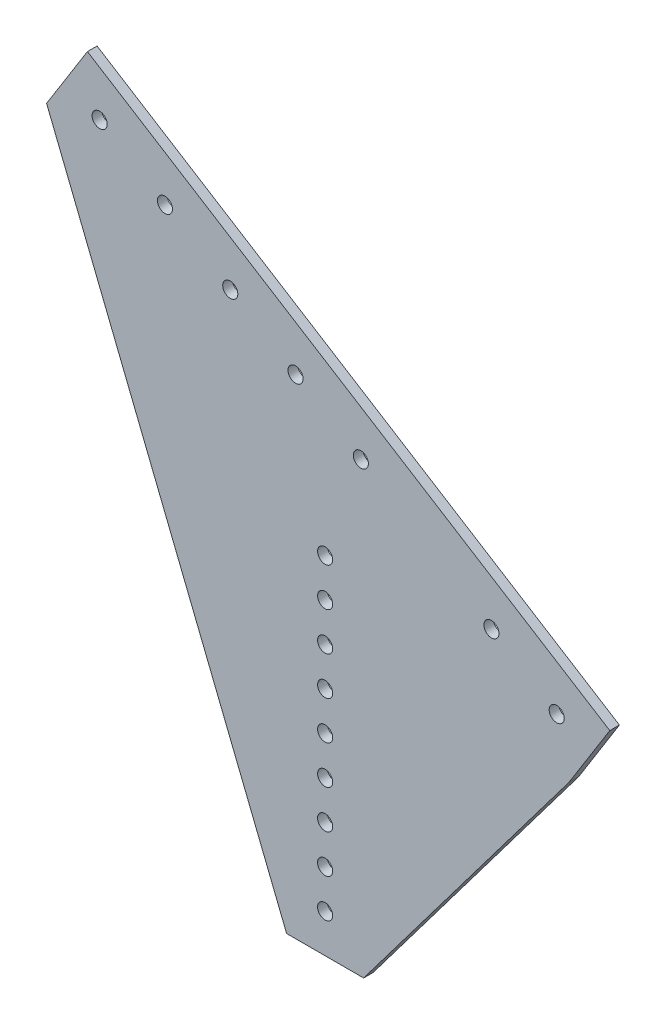
ISO-10303-21;
HEADER;
FILE_DESCRIPTION(('STEP AP214'),'2;1');
FILE_NAME('part.step','',(''),(''),'','','');
FILE_SCHEMA(('AUTOMOTIVE_DESIGN { 1 0 10303 214 1 1 1 1 }'));
ENDSEC;
DATA;
#1=APPLICATION_CONTEXT('core data for automotive mechanical design processes');
#2=APPLICATION_PROTOCOL_DEFINITION('international standard','automotive_design',2000,#1);
#3=PRODUCT_CONTEXT('',#1,'mechanical');
#4=PRODUCT('Part','Part','',(#3));
#5=PRODUCT_RELATED_PRODUCT_CATEGORY('part','',(#4));
#6=PRODUCT_DEFINITION_FORMATION('','',#4);
#7=PRODUCT_DEFINITION_CONTEXT('part definition',#1,'design');
#8=PRODUCT_DEFINITION('design','',#6,#7);
#9=PRODUCT_DEFINITION_SHAPE('','',#8);
#10=(LENGTH_UNIT() NAMED_UNIT(*) SI_UNIT(.MILLI.,.METRE.));
#11=(NAMED_UNIT(*) PLANE_ANGLE_UNIT() SI_UNIT($,.RADIAN.));
#12=(NAMED_UNIT(*) SI_UNIT($,.STERADIAN.) SOLID_ANGLE_UNIT());
#13=UNCERTAINTY_MEASURE_WITH_UNIT(LENGTH_MEASURE(1.E-05),#10,'distance_accuracy_value','');
#14=(GEOMETRIC_REPRESENTATION_CONTEXT(3) GLOBAL_UNCERTAINTY_ASSIGNED_CONTEXT((#13)) GLOBAL_UNIT_ASSIGNED_CONTEXT((#10,
#11,#12)) REPRESENTATION_CONTEXT('',''));
#15=CARTESIAN_POINT('',(0.,0.,0.));
#16=DIRECTION('',(0.,0.,1.));
#17=DIRECTION('',(1.,0.,0.));
#18=AXIS2_PLACEMENT_3D('',#15,#16,#17);
#19=CARTESIAN_POINT('',(0.,0.,3.175));
#20=DIRECTION('',(0.,0.,-1.));
#21=DIRECTION('',(-1.,0.,0.));
#22=AXIS2_PLACEMENT_3D('',#19,#20,#21);
#23=PLANE('',#22);
#24=CARTESIAN_POINT('',(151.49329516949,783.277222158567,3.175));
#25=DIRECTION('',(0.,0.,1.));
#26=DIRECTION('',(1.,0.,0.));
#27=AXIS2_PLACEMENT_3D('',#24,#25,#26);
#28=CIRCLE('',#27,2.48919999999999);
#29=CARTESIAN_POINT('',(153.98249516949,783.277222158567,3.175));
#30=VERTEX_POINT('',#29);
#31=EDGE_CURVE('E254',#30,#30,#28,.T.);
#32=ORIENTED_EDGE('',*,*,#31,.F.);
#33=EDGE_LOOP('',(#32));
#34=FACE_BOUND('',#33,.T.);
#35=CARTESIAN_POINT('',(173.024754388706,769.802940586208,3.175));
#36=DIRECTION('',(0.,0.,1.));
#37=DIRECTION('',(1.,0.,0.));
#38=AXIS2_PLACEMENT_3D('',#35,#36,#37);
#39=CIRCLE('',#38,2.48919999999999);
#40=CARTESIAN_POINT('',(175.513954388706,769.802940586208,3.175));
#41=VERTEX_POINT('',#40);
#42=EDGE_CURVE('E261',#41,#41,#39,.T.);
#43=ORIENTED_EDGE('',*,*,#42,.F.);
#44=EDGE_LOOP('',(#43));
#45=FACE_BOUND('',#44,.T.);
#46=CARTESIAN_POINT('',(194.556213607923,756.328659013849,3.175));
#47=DIRECTION('',(0.,0.,1.));
#48=DIRECTION('',(1.,0.,0.));
#49=AXIS2_PLACEMENT_3D('',#46,#47,#48);
#50=CIRCLE('',#49,2.48919999999999);
#51=CARTESIAN_POINT('',(197.045413607923,756.328659013849,3.175));
#52=VERTEX_POINT('',#51);
#53=EDGE_CURVE('E267',#52,#52,#50,.T.);
#54=ORIENTED_EDGE('',*,*,#53,.F.);
#55=EDGE_LOOP('',(#54));
#56=FACE_BOUND('',#55,.T.);
#57=CARTESIAN_POINT('',(259.150591265572,715.905814296771,3.175));
#58=DIRECTION('',(0.,0.,1.));
#59=DIRECTION('',(1.,0.,0.));
#60=AXIS2_PLACEMENT_3D('',#57,#58,#59);
#61=CIRCLE('',#60,2.48919999999994);
#62=CARTESIAN_POINT('',(261.639791265572,715.905814296771,3.175));
#63=VERTEX_POINT('',#62);
#64=EDGE_CURVE('E273',#63,#63,#61,.T.);
#65=ORIENTED_EDGE('',*,*,#64,.F.);
#66=EDGE_LOOP('',(#65));
#67=FACE_BOUND('',#66,.T.);
#68=CARTESIAN_POINT('',(237.619132046355,729.38009586913,3.175));
#69=DIRECTION('',(0.,0.,1.));
#70=DIRECTION('',(1.,0.,0.));
#71=AXIS2_PLACEMENT_3D('',#68,#69,#70);
#72=CIRCLE('',#71,2.48919999999999);
#73=CARTESIAN_POINT('',(240.108332046355,729.38009586913,3.175));
#74=VERTEX_POINT('',#73);
#75=EDGE_CURVE('E239',#74,#74,#72,.T.);
#76=ORIENTED_EDGE('',*,*,#75,.F.);
#77=EDGE_LOOP('',(#76));
#78=FACE_BOUND('',#77,.T.);
#79=CARTESIAN_POINT('',(108.430376731057,810.225785303285,3.175));
#80=DIRECTION('',(0.,0.,1.));
#81=DIRECTION('',(1.,0.,0.));
#82=AXIS2_PLACEMENT_3D('',#79,#80,#81);
#83=CIRCLE('',#82,2.48919999999999);
#84=CARTESIAN_POINT('',(110.919576731057,810.225785303285,3.175));
#85=VERTEX_POINT('',#84);
#86=EDGE_CURVE('E244',#85,#85,#83,.T.);
#87=ORIENTED_EDGE('',*,*,#86,.F.);
#88=EDGE_LOOP('',(#87));
#89=FACE_BOUND('',#88,.T.);
#90=CARTESIAN_POINT('',(129.961835950274,796.751503730926,3.175));
#91=DIRECTION('',(0.,0.,1.));
#92=DIRECTION('',(1.,0.,0.));
#93=AXIS2_PLACEMENT_3D('',#90,#91,#92);
#94=CIRCLE('',#93,2.48919999999999);
#95=CARTESIAN_POINT('',(132.451035950274,796.751503730926,3.175));
#96=VERTEX_POINT('',#95);
#97=EDGE_CURVE('E278',#96,#96,#94,.T.);
#98=ORIENTED_EDGE('',*,*,#97,.F.);
#99=EDGE_LOOP('',(#98));
#100=FACE_BOUND('',#99,.T.);
#101=DIRECTION('',(-0.530483526470835,-0.847695244851041,0.));
#102=VECTOR('',#101,1.);
#103=CARTESIAN_POINT('',(90.9275063352694,806.197196479857,3.175));
#104=LINE('',#103,#102);
#105=CARTESIAN_POINT('',(104.401787907629,827.728655699073,3.175));
#106=VERTEX_POINT('',#105);
#107=CARTESIAN_POINT('',(90.9275063352694,806.197196479857,3.175));
#108=VERTEX_POINT('',#107);
#109=EDGE_CURVE('E139',#106,#108,#104,.T.);
#110=ORIENTED_EDGE('',*,*,#109,.T.);
#111=DIRECTION('',(0.371984831101606,-0.928238808405633,0.));
#112=VECTOR('',#111,1.);
#113=CARTESIAN_POINT('',(170.07673083068,608.69080458136,3.175));
#114=LINE('',#113,#112);
#115=CARTESIAN_POINT('',(170.07673083068,608.69080458136,3.175));
#116=VERTEX_POINT('',#115);
#117=EDGE_CURVE('E97',#108,#116,#114,.T.);
#118=ORIENTED_EDGE('',*,*,#117,.T.);
#119=DIRECTION('',(1.,0.,0.));
#120=VECTOR('',#119,1.);
#121=CARTESIAN_POINT('',(195.476730830681,608.690804581359,3.175));
#122=LINE('',#121,#120);
#123=CARTESIAN_POINT('',(195.476730830681,608.690804581359,3.175));
#124=VERTEX_POINT('',#123);
#125=EDGE_CURVE('E110',#116,#124,#122,.T.);
#126=ORIENTED_EDGE('',*,*,#125,.T.);
#127=DIRECTION('',(0.602379550490684,0.798209795198381,0.));
#128=VECTOR('',#127,1.);
#129=CARTESIAN_POINT('',(263.179180089001,698.402943900983,3.175));
#130=LINE('',#129,#128);
#131=CARTESIAN_POINT('',(263.179180089001,698.402943900983,3.175));
#132=VERTEX_POINT('',#131);
#133=EDGE_CURVE('E104',#124,#132,#130,.T.);
#134=ORIENTED_EDGE('',*,*,#133,.T.);
#135=DIRECTION('',(0.530483526470834,0.847695244851042,0.));
#136=VECTOR('',#135,1.);
#137=CARTESIAN_POINT('',(276.65346166136,719.934403120199,3.175));
#138=LINE('',#137,#136);
#139=CARTESIAN_POINT('',(276.65346166136,719.934403120199,3.175));
#140=VERTEX_POINT('',#139);
#141=EDGE_CURVE('E108',#132,#140,#138,.T.);
#142=ORIENTED_EDGE('',*,*,#141,.T.);
#143=DIRECTION('',(-0.847695244851041,0.530483526470836,0.));
#144=VECTOR('',#143,1.);
#145=CARTESIAN_POINT('',(104.401787907629,827.728655699073,3.175));
#146=LINE('',#145,#144);
#147=EDGE_CURVE('E60',#140,#106,#146,.T.);
#148=ORIENTED_EDGE('',*,*,#147,.T.);
#149=EDGE_LOOP('',(#110,#118,#126,#134,#142,#148));
#150=FACE_BOUND('',#149,.T.);
#151=CARTESIAN_POINT('',(182.77673083068,621.390804581359,3.175));
#152=DIRECTION('',(0.,0.,1.));
#153=DIRECTION('',(1.,0.,0.));
#154=AXIS2_PLACEMENT_3D('',#151,#152,#153);
#155=CIRCLE('',#154,2.48919999999999);
#156=CARTESIAN_POINT('',(185.26593083068,621.390804581359,3.175));
#157=VERTEX_POINT('',#156);
#158=EDGE_CURVE('E132',#157,#157,#155,.T.);
#159=ORIENTED_EDGE('',*,*,#158,.F.);
#160=EDGE_LOOP('',(#159));
#161=FACE_BOUND('',#160,.T.);
#162=CARTESIAN_POINT('',(182.77673083068,634.09080458136,3.175));
#163=DIRECTION('',(0.,0.,1.));
#164=DIRECTION('',(1.,0.,0.));
#165=AXIS2_PLACEMENT_3D('',#162,#163,#164);
#166=CIRCLE('',#165,2.48919999999999);
#167=CARTESIAN_POINT('',(185.26593083068,634.09080458136,3.175));
#168=VERTEX_POINT('',#167);
#169=EDGE_CURVE('E326',#168,#168,#166,.T.);
#170=ORIENTED_EDGE('',*,*,#169,.F.);
#171=EDGE_LOOP('',(#170));
#172=FACE_BOUND('',#171,.T.);
#173=CARTESIAN_POINT('',(182.77673083068,646.79080458136,3.175));
#174=DIRECTION('',(0.,0.,1.));
#175=DIRECTION('',(1.,0.,0.));
#176=AXIS2_PLACEMENT_3D('',#173,#174,#175);
#177=CIRCLE('',#176,2.48919999999999);
#178=CARTESIAN_POINT('',(185.26593083068,646.79080458136,3.175));
#179=VERTEX_POINT('',#178);
#180=EDGE_CURVE('E320',#179,#179,#177,.T.);
#181=ORIENTED_EDGE('',*,*,#180,.F.);
#182=EDGE_LOOP('',(#181));
#183=FACE_BOUND('',#182,.T.);
#184=CARTESIAN_POINT('',(182.77673083068,659.49080458136,3.175));
#185=DIRECTION('',(0.,0.,1.));
#186=DIRECTION('',(1.,0.,0.));
#187=AXIS2_PLACEMENT_3D('',#184,#185,#186);
#188=CIRCLE('',#187,2.48919999999999);
#189=CARTESIAN_POINT('',(185.26593083068,659.49080458136,3.175));
#190=VERTEX_POINT('',#189);
#191=EDGE_CURVE('E314',#190,#190,#188,.T.);
#192=ORIENTED_EDGE('',*,*,#191,.F.);
#193=EDGE_LOOP('',(#192));
#194=FACE_BOUND('',#193,.T.);
#195=CARTESIAN_POINT('',(182.77673083068,672.19080458136,3.175));
#196=DIRECTION('',(0.,0.,1.));
#197=DIRECTION('',(1.,0.,0.));
#198=AXIS2_PLACEMENT_3D('',#195,#196,#197);
#199=CIRCLE('',#198,2.48919999999999);
#200=CARTESIAN_POINT('',(185.26593083068,672.19080458136,3.175));
#201=VERTEX_POINT('',#200);
#202=EDGE_CURVE('E308',#201,#201,#199,.T.);
#203=ORIENTED_EDGE('',*,*,#202,.F.);
#204=EDGE_LOOP('',(#203));
#205=FACE_BOUND('',#204,.T.);
#206=CARTESIAN_POINT('',(182.77673083068,684.89080458136,3.175));
#207=DIRECTION('',(0.,0.,1.));
#208=DIRECTION('',(1.,0.,0.));
#209=AXIS2_PLACEMENT_3D('',#206,#207,#208);
#210=CIRCLE('',#209,2.48919999999999);
#211=CARTESIAN_POINT('',(185.26593083068,684.89080458136,3.175));
#212=VERTEX_POINT('',#211);
#213=EDGE_CURVE('E302',#212,#212,#210,.T.);
#214=ORIENTED_EDGE('',*,*,#213,.F.);
#215=EDGE_LOOP('',(#214));
#216=FACE_BOUND('',#215,.T.);
#217=CARTESIAN_POINT('',(182.77673083068,697.59080458136,3.175));
#218=DIRECTION('',(0.,0.,1.));
#219=DIRECTION('',(1.,0.,0.));
#220=AXIS2_PLACEMENT_3D('',#217,#218,#219);
#221=CIRCLE('',#220,2.48919999999999);
#222=CARTESIAN_POINT('',(185.26593083068,697.59080458136,3.175));
#223=VERTEX_POINT('',#222);
#224=EDGE_CURVE('E296',#223,#223,#221,.T.);
#225=ORIENTED_EDGE('',*,*,#224,.F.);
#226=EDGE_LOOP('',(#225));
#227=FACE_BOUND('',#226,.T.);
#228=CARTESIAN_POINT('',(182.77673083068,710.29080458136,3.175));
#229=DIRECTION('',(0.,0.,1.));
#230=DIRECTION('',(1.,0.,0.));
#231=AXIS2_PLACEMENT_3D('',#228,#229,#230);
#232=CIRCLE('',#231,2.48919999999999);
#233=CARTESIAN_POINT('',(185.26593083068,710.29080458136,3.175));
#234=VERTEX_POINT('',#233);
#235=EDGE_CURVE('E290',#234,#234,#232,.T.);
#236=ORIENTED_EDGE('',*,*,#235,.F.);
#237=EDGE_LOOP('',(#236));
#238=FACE_BOUND('',#237,.T.);
#239=CARTESIAN_POINT('',(182.77673083068,722.99080458136,3.175));
#240=DIRECTION('',(0.,0.,1.));
#241=DIRECTION('',(1.,0.,0.));
#242=AXIS2_PLACEMENT_3D('',#239,#240,#241);
#243=CIRCLE('',#242,2.48919999999999);
#244=CARTESIAN_POINT('',(185.26593083068,722.99080458136,3.175));
#245=VERTEX_POINT('',#244);
#246=EDGE_CURVE('E284',#245,#245,#243,.T.);
#247=ORIENTED_EDGE('',*,*,#246,.F.);
#248=EDGE_LOOP('',(#247));
#249=FACE_BOUND('',#248,.T.);
#250=ADVANCED_FACE('F43',(#34,#45,#56,#67,#78,#89,#100,#150,#161,#172,#183,#194,#205,#216,#227,
#238,#249),#23,.F.);
#251=CARTESIAN_POINT('',(0.,0.,0.));
#252=DIRECTION('',(0.,0.,-1.));
#253=DIRECTION('',(-1.,0.,0.));
#254=AXIS2_PLACEMENT_3D('',#251,#252,#253);
#255=PLANE('',#254);
#256=CARTESIAN_POINT('',(151.49329516949,783.277222158567,0.));
#257=DIRECTION('',(0.,0.,1.));
#258=DIRECTION('',(1.,0.,0.));
#259=AXIS2_PLACEMENT_3D('',#256,#257,#258);
#260=CIRCLE('',#259,2.48919999999999);
#261=CARTESIAN_POINT('',(153.98249516949,783.277222158567,0.));
#262=VERTEX_POINT('',#261);
#263=EDGE_CURVE('E258',#262,#262,#260,.T.);
#264=ORIENTED_EDGE('',*,*,#263,.T.);
#265=EDGE_LOOP('',(#264));
#266=FACE_BOUND('',#265,.T.);
#267=CARTESIAN_POINT('',(173.024754388706,769.802940586208,0.));
#268=DIRECTION('',(0.,0.,1.));
#269=DIRECTION('',(1.,0.,0.));
#270=AXIS2_PLACEMENT_3D('',#267,#268,#269);
#271=CIRCLE('',#270,2.48919999999999);
#272=CARTESIAN_POINT('',(175.513954388706,769.802940586208,0.));
#273=VERTEX_POINT('',#272);
#274=EDGE_CURVE('E264',#273,#273,#271,.T.);
#275=ORIENTED_EDGE('',*,*,#274,.T.);
#276=EDGE_LOOP('',(#275));
#277=FACE_BOUND('',#276,.T.);
#278=CARTESIAN_POINT('',(194.556213607923,756.328659013849,0.));
#279=DIRECTION('',(0.,0.,1.));
#280=DIRECTION('',(1.,0.,0.));
#281=AXIS2_PLACEMENT_3D('',#278,#279,#280);
#282=CIRCLE('',#281,2.48919999999999);
#283=CARTESIAN_POINT('',(197.045413607923,756.328659013849,0.));
#284=VERTEX_POINT('',#283);
#285=EDGE_CURVE('E270',#284,#284,#282,.T.);
#286=ORIENTED_EDGE('',*,*,#285,.T.);
#287=EDGE_LOOP('',(#286));
#288=FACE_BOUND('',#287,.T.);
#289=CARTESIAN_POINT('',(259.150591265572,715.905814296771,0.));
#290=DIRECTION('',(0.,0.,1.));
#291=DIRECTION('',(1.,0.,0.));
#292=AXIS2_PLACEMENT_3D('',#289,#290,#291);
#293=CIRCLE('',#292,2.48919999999994);
#294=CARTESIAN_POINT('',(261.639791265572,715.905814296771,0.));
#295=VERTEX_POINT('',#294);
#296=EDGE_CURVE('E246',#295,#295,#293,.T.);
#297=ORIENTED_EDGE('',*,*,#296,.T.);
#298=EDGE_LOOP('',(#297));
#299=FACE_BOUND('',#298,.T.);
#300=CARTESIAN_POINT('',(237.619132046355,729.38009586913,0.));
#301=DIRECTION('',(0.,0.,1.));
#302=DIRECTION('',(1.,0.,0.));
#303=AXIS2_PLACEMENT_3D('',#300,#301,#302);
#304=CIRCLE('',#303,2.48919999999999);
#305=CARTESIAN_POINT('',(240.108332046355,729.38009586913,0.));
#306=VERTEX_POINT('',#305);
#307=EDGE_CURVE('E242',#306,#306,#304,.T.);
#308=ORIENTED_EDGE('',*,*,#307,.T.);
#309=EDGE_LOOP('',(#308));
#310=FACE_BOUND('',#309,.T.);
#311=CARTESIAN_POINT('',(108.430376731057,810.225785303285,0.));
#312=DIRECTION('',(0.,0.,1.));
#313=DIRECTION('',(1.,0.,0.));
#314=AXIS2_PLACEMENT_3D('',#311,#312,#313);
#315=CIRCLE('',#314,2.48919999999999);
#316=CARTESIAN_POINT('',(110.919576731057,810.225785303285,0.));
#317=VERTEX_POINT('',#316);
#318=EDGE_CURVE('E249',#317,#317,#315,.T.);
#319=ORIENTED_EDGE('',*,*,#318,.T.);
#320=EDGE_LOOP('',(#319));
#321=FACE_BOUND('',#320,.T.);
#322=CARTESIAN_POINT('',(129.961835950274,796.751503730926,0.));
#323=DIRECTION('',(0.,0.,1.));
#324=DIRECTION('',(1.,0.,0.));
#325=AXIS2_PLACEMENT_3D('',#322,#323,#324);
#326=CIRCLE('',#325,2.48919999999999);
#327=CARTESIAN_POINT('',(132.451035950274,796.751503730926,0.));
#328=VERTEX_POINT('',#327);
#329=EDGE_CURVE('E257',#328,#328,#326,.T.);
#330=ORIENTED_EDGE('',*,*,#329,.T.);
#331=EDGE_LOOP('',(#330));
#332=FACE_BOUND('',#331,.T.);
#333=CARTESIAN_POINT('',(182.77673083068,710.29080458136,0.));
#334=DIRECTION('',(0.,0.,1.));
#335=DIRECTION('',(1.,0.,0.));
#336=AXIS2_PLACEMENT_3D('',#333,#334,#335);
#337=CIRCLE('',#336,2.48919999999999);
#338=CARTESIAN_POINT('',(185.26593083068,710.29080458136,0.));
#339=VERTEX_POINT('',#338);
#340=EDGE_CURVE('E287',#339,#339,#337,.T.);
#341=ORIENTED_EDGE('',*,*,#340,.T.);
#342=EDGE_LOOP('',(#341));
#343=FACE_BOUND('',#342,.T.);
#344=CARTESIAN_POINT('',(182.77673083068,684.89080458136,0.));
#345=DIRECTION('',(0.,0.,1.));
#346=DIRECTION('',(1.,0.,0.));
#347=AXIS2_PLACEMENT_3D('',#344,#345,#346);
#348=CIRCLE('',#347,2.48919999999999);
#349=CARTESIAN_POINT('',(185.26593083068,684.89080458136,0.));
#350=VERTEX_POINT('',#349);
#351=EDGE_CURVE('E299',#350,#350,#348,.T.);
#352=ORIENTED_EDGE('',*,*,#351,.T.);
#353=EDGE_LOOP('',(#352));
#354=FACE_BOUND('',#353,.T.);
#355=CARTESIAN_POINT('',(182.77673083068,659.49080458136,0.));
#356=DIRECTION('',(0.,0.,1.));
#357=DIRECTION('',(1.,0.,0.));
#358=AXIS2_PLACEMENT_3D('',#355,#356,#357);
#359=CIRCLE('',#358,2.48919999999999);
#360=CARTESIAN_POINT('',(185.26593083068,659.49080458136,0.));
#361=VERTEX_POINT('',#360);
#362=EDGE_CURVE('E311',#361,#361,#359,.T.);
#363=ORIENTED_EDGE('',*,*,#362,.T.);
#364=EDGE_LOOP('',(#363));
#365=FACE_BOUND('',#364,.T.);
#366=CARTESIAN_POINT('',(182.77673083068,634.09080458136,0.));
#367=DIRECTION('',(0.,0.,1.));
#368=DIRECTION('',(1.,0.,0.));
#369=AXIS2_PLACEMENT_3D('',#366,#367,#368);
#370=CIRCLE('',#369,2.48919999999999);
#371=CARTESIAN_POINT('',(185.26593083068,634.09080458136,0.));
#372=VERTEX_POINT('',#371);
#373=EDGE_CURVE('E323',#372,#372,#370,.T.);
#374=ORIENTED_EDGE('',*,*,#373,.T.);
#375=EDGE_LOOP('',(#374));
#376=FACE_BOUND('',#375,.T.);
#377=DIRECTION('',(-0.530483526470835,-0.847695244851041,0.));
#378=VECTOR('',#377,1.);
#379=CARTESIAN_POINT('',(90.9275063352694,806.197196479857,0.));
#380=LINE('',#379,#378);
#381=CARTESIAN_POINT('',(104.401787907629,827.728655699073,0.));
#382=VERTEX_POINT('',#381);
#383=CARTESIAN_POINT('',(90.9275063352694,806.197196479857,0.));
#384=VERTEX_POINT('',#383);
#385=EDGE_CURVE('E128',#382,#384,#380,.T.);
#386=ORIENTED_EDGE('',*,*,#385,.F.);
#387=DIRECTION('',(-0.847695244851041,0.530483526470836,0.));
#388=VECTOR('',#387,1.);
#389=CARTESIAN_POINT('',(104.401787907629,827.728655699073,0.));
#390=LINE('',#389,#388);
#391=CARTESIAN_POINT('',(276.65346166136,719.934403120199,0.));
#392=VERTEX_POINT('',#391);
#393=EDGE_CURVE('E89',#392,#382,#390,.T.);
#394=ORIENTED_EDGE('',*,*,#393,.F.);
#395=DIRECTION('',(0.530483526470834,0.847695244851042,0.));
#396=VECTOR('',#395,1.);
#397=CARTESIAN_POINT('',(276.65346166136,719.934403120199,0.));
#398=LINE('',#397,#396);
#399=CARTESIAN_POINT('',(263.179180089001,698.402943900983,0.));
#400=VERTEX_POINT('',#399);
#401=EDGE_CURVE('E83',#400,#392,#398,.T.);
#402=ORIENTED_EDGE('',*,*,#401,.F.);
#403=DIRECTION('',(0.602379550490684,0.798209795198381,0.));
#404=VECTOR('',#403,1.);
#405=CARTESIAN_POINT('',(263.179180089001,698.402943900983,0.));
#406=LINE('',#405,#404);
#407=CARTESIAN_POINT('',(195.476730830681,608.690804581359,0.));
#408=VERTEX_POINT('',#407);
#409=EDGE_CURVE('E118',#408,#400,#406,.T.);
#410=ORIENTED_EDGE('',*,*,#409,.F.);
#411=DIRECTION('',(1.,0.,0.));
#412=VECTOR('',#411,1.);
#413=CARTESIAN_POINT('',(195.476730830681,608.690804581359,0.));
#414=LINE('',#413,#412);
#415=CARTESIAN_POINT('',(170.07673083068,608.69080458136,0.));
#416=VERTEX_POINT('',#415);
#417=EDGE_CURVE('E134',#416,#408,#414,.T.);
#418=ORIENTED_EDGE('',*,*,#417,.F.);
#419=DIRECTION('',(0.371984831101606,-0.928238808405633,0.));
#420=VECTOR('',#419,1.);
#421=CARTESIAN_POINT('',(170.07673083068,608.69080458136,0.));
#422=LINE('',#421,#420);
#423=EDGE_CURVE('E131',#384,#416,#422,.T.);
#424=ORIENTED_EDGE('',*,*,#423,.F.);
#425=EDGE_LOOP('',(#386,#394,#402,#410,#418,#424));
#426=FACE_BOUND('',#425,.T.);
#427=CARTESIAN_POINT('',(182.77673083068,621.390804581359,0.));
#428=DIRECTION('',(0.,0.,1.));
#429=DIRECTION('',(1.,0.,0.));
#430=AXIS2_PLACEMENT_3D('',#427,#428,#429);
#431=CIRCLE('',#430,2.48919999999999);
#432=CARTESIAN_POINT('',(185.26593083068,621.390804581359,0.));
#433=VERTEX_POINT('',#432);
#434=EDGE_CURVE('E329',#433,#433,#431,.T.);
#435=ORIENTED_EDGE('',*,*,#434,.T.);
#436=EDGE_LOOP('',(#435));
#437=FACE_BOUND('',#436,.T.);
#438=CARTESIAN_POINT('',(182.77673083068,646.79080458136,0.));
#439=DIRECTION('',(0.,0.,1.));
#440=DIRECTION('',(1.,0.,0.));
#441=AXIS2_PLACEMENT_3D('',#438,#439,#440);
#442=CIRCLE('',#441,2.48919999999999);
#443=CARTESIAN_POINT('',(185.26593083068,646.79080458136,0.));
#444=VERTEX_POINT('',#443);
#445=EDGE_CURVE('E317',#444,#444,#442,.T.);
#446=ORIENTED_EDGE('',*,*,#445,.T.);
#447=EDGE_LOOP('',(#446));
#448=FACE_BOUND('',#447,.T.);
#449=CARTESIAN_POINT('',(182.77673083068,672.19080458136,0.));
#450=DIRECTION('',(0.,0.,1.));
#451=DIRECTION('',(1.,0.,0.));
#452=AXIS2_PLACEMENT_3D('',#449,#450,#451);
#453=CIRCLE('',#452,2.48919999999999);
#454=CARTESIAN_POINT('',(185.26593083068,672.19080458136,0.));
#455=VERTEX_POINT('',#454);
#456=EDGE_CURVE('E305',#455,#455,#453,.T.);
#457=ORIENTED_EDGE('',*,*,#456,.T.);
#458=EDGE_LOOP('',(#457));
#459=FACE_BOUND('',#458,.T.);
#460=CARTESIAN_POINT('',(182.77673083068,697.59080458136,0.));
#461=DIRECTION('',(0.,0.,1.));
#462=DIRECTION('',(1.,0.,0.));
#463=AXIS2_PLACEMENT_3D('',#460,#461,#462);
#464=CIRCLE('',#463,2.48919999999999);
#465=CARTESIAN_POINT('',(185.26593083068,697.59080458136,0.));
#466=VERTEX_POINT('',#465);
#467=EDGE_CURVE('E293',#466,#466,#464,.T.);
#468=ORIENTED_EDGE('',*,*,#467,.T.);
#469=EDGE_LOOP('',(#468));
#470=FACE_BOUND('',#469,.T.);
#471=CARTESIAN_POINT('',(182.77673083068,722.99080458136,0.));
#472=DIRECTION('',(0.,0.,1.));
#473=DIRECTION('',(1.,0.,0.));
#474=AXIS2_PLACEMENT_3D('',#471,#472,#473);
#475=CIRCLE('',#474,2.48919999999999);
#476=CARTESIAN_POINT('',(185.26593083068,722.99080458136,0.));
#477=VERTEX_POINT('',#476);
#478=EDGE_CURVE('E281',#477,#477,#475,.T.);
#479=ORIENTED_EDGE('',*,*,#478,.T.);
#480=EDGE_LOOP('',(#479));
#481=FACE_BOUND('',#480,.T.);
#482=ADVANCED_FACE('F148',(#266,#277,#288,#299,#310,#321,#332,#343,#354,#365,#376,#426,#437,
#448,#459,#470,#481),#255,.T.);
#483=CARTESIAN_POINT('',(90.9275063352694,806.197196479857,3.175));
#484=DIRECTION('',(0.847695244851041,-0.530483526470836,0.));
#485=DIRECTION('',(0.530483526470836,0.847695244851041,0.));
#486=AXIS2_PLACEMENT_3D('',#483,#484,#485);
#487=PLANE('',#486);
#488=ORIENTED_EDGE('',*,*,#385,.T.);
#489=DIRECTION('',(0.,0.,-1.));
#490=VECTOR('',#489,1.);
#491=CARTESIAN_POINT('',(90.9275063352694,806.197196479857,3.175));
#492=LINE('',#491,#490);
#493=EDGE_CURVE('E11',#108,#384,#492,.T.);
#494=ORIENTED_EDGE('',*,*,#493,.F.);
#495=ORIENTED_EDGE('',*,*,#109,.F.);
#496=DIRECTION('',(0.,0.,-1.));
#497=VECTOR('',#496,1.);
#498=CARTESIAN_POINT('',(104.401787907629,827.728655699073,3.175));
#499=LINE('',#498,#497);
#500=EDGE_CURVE('E124',#106,#382,#499,.T.);
#501=ORIENTED_EDGE('',*,*,#500,.T.);
#502=EDGE_LOOP('',(#488,#494,#495,#501));
#503=FACE_BOUND('',#502,.T.);
#504=ADVANCED_FACE('F45',(#503),#487,.F.);
#505=CARTESIAN_POINT('',(170.07673083068,608.69080458136,3.175));
#506=DIRECTION('',(0.928238808405633,0.371984831101606,0.));
#507=DIRECTION('',(-0.371984831101606,0.928238808405633,0.));
#508=AXIS2_PLACEMENT_3D('',#505,#506,#507);
#509=PLANE('',#508);
#510=ORIENTED_EDGE('',*,*,#423,.T.);
#511=DIRECTION('',(0.,0.,-1.));
#512=VECTOR('',#511,1.);
#513=CARTESIAN_POINT('',(170.07673083068,608.69080458136,3.175));
#514=LINE('',#513,#512);
#515=EDGE_CURVE('E52',#116,#416,#514,.T.);
#516=ORIENTED_EDGE('',*,*,#515,.F.);
#517=ORIENTED_EDGE('',*,*,#117,.F.);
#518=ORIENTED_EDGE('',*,*,#493,.T.);
#519=EDGE_LOOP('',(#510,#516,#517,#518));
#520=FACE_BOUND('',#519,.T.);
#521=ADVANCED_FACE('F512',(#520),#509,.F.);
#522=CARTESIAN_POINT('',(195.476730830681,608.690804581359,3.175));
#523=DIRECTION('',(0.,1.,0.));
#524=DIRECTION('',(-1.,0.,0.));
#525=AXIS2_PLACEMENT_3D('',#522,#523,#524);
#526=PLANE('',#525);
#527=ORIENTED_EDGE('',*,*,#417,.T.);
#528=DIRECTION('',(0.,0.,-1.));
#529=VECTOR('',#528,1.);
#530=CARTESIAN_POINT('',(195.476730830681,608.690804581359,3.175));
#531=LINE('',#530,#529);
#532=EDGE_CURVE('E119',#124,#408,#531,.T.);
#533=ORIENTED_EDGE('',*,*,#532,.F.);
#534=ORIENTED_EDGE('',*,*,#125,.F.);
#535=ORIENTED_EDGE('',*,*,#515,.T.);
#536=EDGE_LOOP('',(#527,#533,#534,#535));
#537=FACE_BOUND('',#536,.T.);
#538=ADVANCED_FACE('F145',(#537),#526,.F.);
#539=CARTESIAN_POINT('',(263.179180089001,698.402943900983,3.175));
#540=DIRECTION('',(-0.798209795198381,0.602379550490684,0.));
#541=DIRECTION('',(-0.602379550490684,-0.798209795198381,0.));
#542=AXIS2_PLACEMENT_3D('',#539,#540,#541);
#543=PLANE('',#542);
#544=ORIENTED_EDGE('',*,*,#409,.T.);
#545=DIRECTION('',(0.,0.,-1.));
#546=VECTOR('',#545,1.);
#547=CARTESIAN_POINT('',(263.179180089001,698.402943900983,3.175));
#548=LINE('',#547,#546);
#549=EDGE_CURVE('E115',#132,#400,#548,.T.);
#550=ORIENTED_EDGE('',*,*,#549,.F.);
#551=ORIENTED_EDGE('',*,*,#133,.F.);
#552=ORIENTED_EDGE('',*,*,#532,.T.);
#553=EDGE_LOOP('',(#544,#550,#551,#552));
#554=FACE_BOUND('',#553,.T.);
#555=ADVANCED_FACE('F116',(#554),#543,.F.);
#556=CARTESIAN_POINT('',(276.65346166136,719.934403120199,3.175));
#557=DIRECTION('',(-0.847695244851042,0.530483526470834,0.));
#558=DIRECTION('',(-0.530483526470834,-0.847695244851042,0.));
#559=AXIS2_PLACEMENT_3D('',#556,#557,#558);
#560=PLANE('',#559);
#561=ORIENTED_EDGE('',*,*,#401,.T.);
#562=DIRECTION('',(0.,0.,-1.));
#563=VECTOR('',#562,1.);
#564=CARTESIAN_POINT('',(276.65346166136,719.934403120199,3.175));
#565=LINE('',#564,#563);
#566=EDGE_CURVE('E120',#140,#392,#565,.T.);
#567=ORIENTED_EDGE('',*,*,#566,.F.);
#568=ORIENTED_EDGE('',*,*,#141,.F.);
#569=ORIENTED_EDGE('',*,*,#549,.T.);
#570=EDGE_LOOP('',(#561,#567,#568,#569));
#571=FACE_BOUND('',#570,.T.);
#572=ADVANCED_FACE('F122',(#571),#560,.F.);
#573=CARTESIAN_POINT('',(104.401787907629,827.728655699073,3.175));
#574=DIRECTION('',(-0.530483526470836,-0.847695244851041,0.));
#575=DIRECTION('',(0.847695244851041,-0.530483526470836,0.));
#576=AXIS2_PLACEMENT_3D('',#573,#574,#575);
#577=PLANE('',#576);
#578=ORIENTED_EDGE('',*,*,#393,.T.);
#579=ORIENTED_EDGE('',*,*,#500,.F.);
#580=ORIENTED_EDGE('',*,*,#147,.F.);
#581=ORIENTED_EDGE('',*,*,#566,.T.);
#582=EDGE_LOOP('',(#578,#579,#580,#581));
#583=FACE_BOUND('',#582,.T.);
#584=ADVANCED_FACE('F153',(#583),#577,.F.);
#585=CARTESIAN_POINT('',(182.77673083068,621.390804581359,3.175));
#586=DIRECTION('',(0.,0.,-1.));
#587=DIRECTION('',(-1.,0.,0.));
#588=AXIS2_PLACEMENT_3D('',#585,#586,#587);
#589=CYLINDRICAL_SURFACE('',#588,2.48919999999999);
#590=ORIENTED_EDGE('',*,*,#158,.T.);
#591=EDGE_LOOP('',(#590));
#592=FACE_BOUND('',#591,.T.);
#593=ORIENTED_EDGE('',*,*,#434,.F.);
#594=EDGE_LOOP('',(#593));
#595=FACE_BOUND('',#594,.T.);
#596=ADVANCED_FACE('F155',(#592,#595),#589,.F.);
#597=CARTESIAN_POINT('',(182.77673083068,634.09080458136,3.175));
#598=DIRECTION('',(0.,0.,-1.));
#599=DIRECTION('',(-1.,0.,0.));
#600=AXIS2_PLACEMENT_3D('',#597,#598,#599);
#601=CYLINDRICAL_SURFACE('',#600,2.48919999999999);
#602=ORIENTED_EDGE('',*,*,#169,.T.);
#603=EDGE_LOOP('',(#602));
#604=FACE_BOUND('',#603,.T.);
#605=ORIENTED_EDGE('',*,*,#373,.F.);
#606=EDGE_LOOP('',(#605));
#607=FACE_BOUND('',#606,.T.);
#608=ADVANCED_FACE('F161',(#604,#607),#601,.F.);
#609=CARTESIAN_POINT('',(182.77673083068,646.79080458136,3.175));
#610=DIRECTION('',(0.,0.,-1.));
#611=DIRECTION('',(-1.,0.,0.));
#612=AXIS2_PLACEMENT_3D('',#609,#610,#611);
#613=CYLINDRICAL_SURFACE('',#612,2.48919999999999);
#614=ORIENTED_EDGE('',*,*,#180,.T.);
#615=EDGE_LOOP('',(#614));
#616=FACE_BOUND('',#615,.T.);
#617=ORIENTED_EDGE('',*,*,#445,.F.);
#618=EDGE_LOOP('',(#617));
#619=FACE_BOUND('',#618,.T.);
#620=ADVANCED_FACE('F179',(#616,#619),#613,.F.);
#621=CARTESIAN_POINT('',(182.77673083068,659.49080458136,3.175));
#622=DIRECTION('',(0.,0.,-1.));
#623=DIRECTION('',(-1.,0.,0.));
#624=AXIS2_PLACEMENT_3D('',#621,#622,#623);
#625=CYLINDRICAL_SURFACE('',#624,2.48919999999999);
#626=ORIENTED_EDGE('',*,*,#191,.T.);
#627=EDGE_LOOP('',(#626));
#628=FACE_BOUND('',#627,.T.);
#629=ORIENTED_EDGE('',*,*,#362,.F.);
#630=EDGE_LOOP('',(#629));
#631=FACE_BOUND('',#630,.T.);
#632=ADVANCED_FACE('F183',(#628,#631),#625,.F.);
#633=CARTESIAN_POINT('',(182.77673083068,672.19080458136,3.175));
#634=DIRECTION('',(0.,0.,-1.));
#635=DIRECTION('',(-1.,0.,0.));
#636=AXIS2_PLACEMENT_3D('',#633,#634,#635);
#637=CYLINDRICAL_SURFACE('',#636,2.48919999999999);
#638=ORIENTED_EDGE('',*,*,#202,.T.);
#639=EDGE_LOOP('',(#638));
#640=FACE_BOUND('',#639,.T.);
#641=ORIENTED_EDGE('',*,*,#456,.F.);
#642=EDGE_LOOP('',(#641));
#643=FACE_BOUND('',#642,.T.);
#644=ADVANCED_FACE('F187',(#640,#643),#637,.F.);
#645=CARTESIAN_POINT('',(182.77673083068,684.89080458136,3.175));
#646=DIRECTION('',(0.,0.,-1.));
#647=DIRECTION('',(-1.,0.,0.));
#648=AXIS2_PLACEMENT_3D('',#645,#646,#647);
#649=CYLINDRICAL_SURFACE('',#648,2.48919999999999);
#650=ORIENTED_EDGE('',*,*,#213,.T.);
#651=EDGE_LOOP('',(#650));
#652=FACE_BOUND('',#651,.T.);
#653=ORIENTED_EDGE('',*,*,#351,.F.);
#654=EDGE_LOOP('',(#653));
#655=FACE_BOUND('',#654,.T.);
#656=ADVANCED_FACE('F191',(#652,#655),#649,.F.);
#657=CARTESIAN_POINT('',(182.77673083068,697.59080458136,3.175));
#658=DIRECTION('',(0.,0.,-1.));
#659=DIRECTION('',(-1.,0.,0.));
#660=AXIS2_PLACEMENT_3D('',#657,#658,#659);
#661=CYLINDRICAL_SURFACE('',#660,2.48919999999999);
#662=ORIENTED_EDGE('',*,*,#224,.T.);
#663=EDGE_LOOP('',(#662));
#664=FACE_BOUND('',#663,.T.);
#665=ORIENTED_EDGE('',*,*,#467,.F.);
#666=EDGE_LOOP('',(#665));
#667=FACE_BOUND('',#666,.T.);
#668=ADVANCED_FACE('F195',(#664,#667),#661,.F.);
#669=CARTESIAN_POINT('',(182.77673083068,710.29080458136,3.175));
#670=DIRECTION('',(0.,0.,-1.));
#671=DIRECTION('',(-1.,0.,0.));
#672=AXIS2_PLACEMENT_3D('',#669,#670,#671);
#673=CYLINDRICAL_SURFACE('',#672,2.48919999999999);
#674=ORIENTED_EDGE('',*,*,#235,.T.);
#675=EDGE_LOOP('',(#674));
#676=FACE_BOUND('',#675,.T.);
#677=ORIENTED_EDGE('',*,*,#340,.F.);
#678=EDGE_LOOP('',(#677));
#679=FACE_BOUND('',#678,.T.);
#680=ADVANCED_FACE('F199',(#676,#679),#673,.F.);
#681=CARTESIAN_POINT('',(182.77673083068,722.99080458136,3.175));
#682=DIRECTION('',(0.,0.,-1.));
#683=DIRECTION('',(-1.,0.,0.));
#684=AXIS2_PLACEMENT_3D('',#681,#682,#683);
#685=CYLINDRICAL_SURFACE('',#684,2.48919999999999);
#686=ORIENTED_EDGE('',*,*,#246,.T.);
#687=EDGE_LOOP('',(#686));
#688=FACE_BOUND('',#687,.T.);
#689=ORIENTED_EDGE('',*,*,#478,.F.);
#690=EDGE_LOOP('',(#689));
#691=FACE_BOUND('',#690,.T.);
#692=ADVANCED_FACE('F203',(#688,#691),#685,.F.);
#693=CARTESIAN_POINT('',(129.961835950274,796.751503730926,3.175));
#694=DIRECTION('',(0.,0.,-1.));
#695=DIRECTION('',(-1.,0.,0.));
#696=AXIS2_PLACEMENT_3D('',#693,#694,#695);
#697=CYLINDRICAL_SURFACE('',#696,2.48919999999999);
#698=ORIENTED_EDGE('',*,*,#97,.T.);
#699=EDGE_LOOP('',(#698));
#700=FACE_BOUND('',#699,.T.);
#701=ORIENTED_EDGE('',*,*,#329,.F.);
#702=EDGE_LOOP('',(#701));
#703=FACE_BOUND('',#702,.T.);
#704=ADVANCED_FACE('F206',(#700,#703),#697,.F.);
#705=CARTESIAN_POINT('',(108.430376731057,810.225785303285,3.175));
#706=DIRECTION('',(0.,0.,-1.));
#707=DIRECTION('',(-1.,0.,0.));
#708=AXIS2_PLACEMENT_3D('',#705,#706,#707);
#709=CYLINDRICAL_SURFACE('',#708,2.48919999999999);
#710=ORIENTED_EDGE('',*,*,#86,.T.);
#711=EDGE_LOOP('',(#710));
#712=FACE_BOUND('',#711,.T.);
#713=ORIENTED_EDGE('',*,*,#318,.F.);
#714=EDGE_LOOP('',(#713));
#715=FACE_BOUND('',#714,.T.);
#716=ADVANCED_FACE('F210',(#712,#715),#709,.F.);
#717=CARTESIAN_POINT('',(237.619132046355,729.38009586913,3.175));
#718=DIRECTION('',(0.,0.,-1.));
#719=DIRECTION('',(-1.,0.,0.));
#720=AXIS2_PLACEMENT_3D('',#717,#718,#719);
#721=CYLINDRICAL_SURFACE('',#720,2.48919999999999);
#722=ORIENTED_EDGE('',*,*,#75,.T.);
#723=EDGE_LOOP('',(#722));
#724=FACE_BOUND('',#723,.T.);
#725=ORIENTED_EDGE('',*,*,#307,.F.);
#726=EDGE_LOOP('',(#725));
#727=FACE_BOUND('',#726,.T.);
#728=ADVANCED_FACE('F216',(#724,#727),#721,.F.);
#729=CARTESIAN_POINT('',(259.150591265572,715.905814296771,3.175));
#730=DIRECTION('',(0.,0.,-1.));
#731=DIRECTION('',(-1.,0.,0.));
#732=AXIS2_PLACEMENT_3D('',#729,#730,#731);
#733=CYLINDRICAL_SURFACE('',#732,2.48919999999994);
#734=ORIENTED_EDGE('',*,*,#64,.T.);
#735=EDGE_LOOP('',(#734));
#736=FACE_BOUND('',#735,.T.);
#737=ORIENTED_EDGE('',*,*,#296,.F.);
#738=EDGE_LOOP('',(#737));
#739=FACE_BOUND('',#738,.T.);
#740=ADVANCED_FACE('F212',(#736,#739),#733,.F.);
#741=CARTESIAN_POINT('',(194.556213607923,756.328659013849,3.175));
#742=DIRECTION('',(0.,0.,-1.));
#743=DIRECTION('',(-1.,0.,0.));
#744=AXIS2_PLACEMENT_3D('',#741,#742,#743);
#745=CYLINDRICAL_SURFACE('',#744,2.48919999999999);
#746=ORIENTED_EDGE('',*,*,#53,.T.);
#747=EDGE_LOOP('',(#746));
#748=FACE_BOUND('',#747,.T.);
#749=ORIENTED_EDGE('',*,*,#285,.F.);
#750=EDGE_LOOP('',(#749));
#751=FACE_BOUND('',#750,.T.);
#752=ADVANCED_FACE('F215',(#748,#751),#745,.F.);
#753=CARTESIAN_POINT('',(173.024754388706,769.802940586208,3.175));
#754=DIRECTION('',(0.,0.,-1.));
#755=DIRECTION('',(-1.,0.,0.));
#756=AXIS2_PLACEMENT_3D('',#753,#754,#755);
#757=CYLINDRICAL_SURFACE('',#756,2.48919999999999);
#758=ORIENTED_EDGE('',*,*,#42,.T.);
#759=EDGE_LOOP('',(#758));
#760=FACE_BOUND('',#759,.T.);
#761=ORIENTED_EDGE('',*,*,#274,.F.);
#762=EDGE_LOOP('',(#761));
#763=FACE_BOUND('',#762,.T.);
#764=ADVANCED_FACE('F220',(#760,#763),#757,.F.);
#765=CARTESIAN_POINT('',(151.49329516949,783.277222158567,3.175));
#766=DIRECTION('',(0.,0.,-1.));
#767=DIRECTION('',(-1.,0.,0.));
#768=AXIS2_PLACEMENT_3D('',#765,#766,#767);
#769=CYLINDRICAL_SURFACE('',#768,2.48919999999999);
#770=ORIENTED_EDGE('',*,*,#31,.T.);
#771=EDGE_LOOP('',(#770));
#772=FACE_BOUND('',#771,.T.);
#773=ORIENTED_EDGE('',*,*,#263,.F.);
#774=EDGE_LOOP('',(#773));
#775=FACE_BOUND('',#774,.T.);
#776=ADVANCED_FACE('F224',(#772,#775),#769,.F.);
#777=CLOSED_SHELL('',(#250,#482,#504,#521,#538,#555,#572,#584,#596,#608,#620,#632,#644,#656,
#668,#680,#692,#704,#716,#728,#740,#752,#764,#776));
#778=MANIFOLD_SOLID_BREP('B2',#777);
#779=ADVANCED_BREP_SHAPE_REPRESENTATION('',(#18,#778),#14);
#780=SHAPE_DEFINITION_REPRESENTATION(#9,#779);
ENDSEC;
END-ISO-10303-21;
